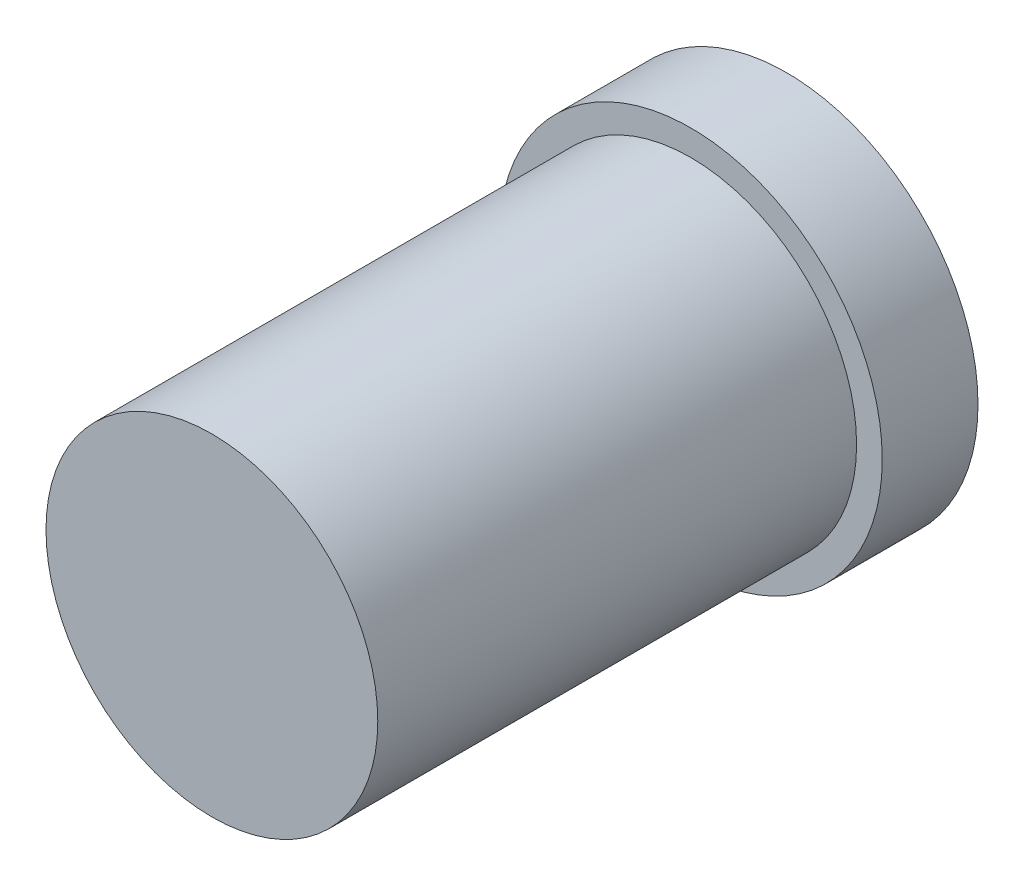
ISO-10303-21;
HEADER;
FILE_DESCRIPTION(('STEP AP214'),'2;1');
FILE_NAME('part.step','',(''),(''),'','','');
FILE_SCHEMA(('AUTOMOTIVE_DESIGN { 1 0 10303 214 1 1 1 1 }'));
ENDSEC;
DATA;
#1=APPLICATION_CONTEXT('core data for automotive mechanical design processes');
#2=APPLICATION_PROTOCOL_DEFINITION('international standard','automotive_design',2000,#1);
#3=PRODUCT_CONTEXT('',#1,'mechanical');
#4=PRODUCT('Part','Part','',(#3));
#5=PRODUCT_RELATED_PRODUCT_CATEGORY('part','',(#4));
#6=PRODUCT_DEFINITION_FORMATION('','',#4);
#7=PRODUCT_DEFINITION_CONTEXT('part definition',#1,'design');
#8=PRODUCT_DEFINITION('design','',#6,#7);
#9=PRODUCT_DEFINITION_SHAPE('','',#8);
#10=(LENGTH_UNIT() NAMED_UNIT(*) SI_UNIT(.MILLI.,.METRE.));
#11=(NAMED_UNIT(*) PLANE_ANGLE_UNIT() SI_UNIT($,.RADIAN.));
#12=(NAMED_UNIT(*) SI_UNIT($,.STERADIAN.) SOLID_ANGLE_UNIT());
#13=UNCERTAINTY_MEASURE_WITH_UNIT(LENGTH_MEASURE(1.E-05),#10,'distance_accuracy_value','');
#14=(GEOMETRIC_REPRESENTATION_CONTEXT(3) GLOBAL_UNCERTAINTY_ASSIGNED_CONTEXT((#13)) GLOBAL_UNIT_ASSIGNED_CONTEXT((#10,
#11,#12)) REPRESENTATION_CONTEXT('',''));
#15=CARTESIAN_POINT('',(0.,0.,0.));
#16=DIRECTION('',(0.,0.,1.));
#17=DIRECTION('',(1.,0.,0.));
#18=AXIS2_PLACEMENT_3D('',#15,#16,#17);
#19=CARTESIAN_POINT('',(0.,0.,-285.75));
#20=DIRECTION('',(0.,0.,1.));
#21=DIRECTION('',(1.,0.,0.));
#22=AXIS2_PLACEMENT_3D('',#19,#20,#21);
#23=CYLINDRICAL_SURFACE('',#22,82.4992);
#24=CARTESIAN_POINT('',(0.,0.,0.));
#25=DIRECTION('',(0.,0.,1.));
#26=DIRECTION('',(1.,0.,0.));
#27=AXIS2_PLACEMENT_3D('',#24,#25,#26);
#28=CIRCLE('',#27,82.4992);
#29=CARTESIAN_POINT('',(82.4992,0.,0.));
#30=VERTEX_POINT('',#29);
#31=EDGE_CURVE('E10',#30,#30,#28,.T.);
#32=ORIENTED_EDGE('',*,*,#31,.F.);
#33=EDGE_LOOP('',(#32));
#34=FACE_BOUND('',#33,.T.);
#35=CARTESIAN_POINT('',(0.,0.,-238.125));
#36=DIRECTION('',(0.,0.,-1.));
#37=DIRECTION('',(-1.,0.,0.));
#38=AXIS2_PLACEMENT_3D('',#35,#36,#37);
#39=CIRCLE('',#38,82.4992);
#40=CARTESIAN_POINT('',(-82.4992,0.,-238.125));
#41=VERTEX_POINT('',#40);
#42=EDGE_CURVE('E40',#41,#41,#39,.F.);
#43=ORIENTED_EDGE('',*,*,#42,.T.);
#44=EDGE_LOOP('',(#43));
#45=FACE_BOUND('',#44,.T.);
#46=ADVANCED_FACE('F37',(#34,#45),#23,.T.);
#47=CARTESIAN_POINT('',(0.,0.,0.));
#48=DIRECTION('',(0.,0.,1.));
#49=DIRECTION('',(1.,0.,0.));
#50=AXIS2_PLACEMENT_3D('',#47,#48,#49);
#51=PLANE('',#50);
#52=ORIENTED_EDGE('',*,*,#31,.T.);
#53=EDGE_LOOP('',(#52));
#54=FACE_BOUND('',#53,.T.);
#55=ADVANCED_FACE('F73',(#54),#51,.T.);
#56=CARTESIAN_POINT('',(0.,0.,-238.125));
#57=DIRECTION('',(0.,0.,-1.));
#58=DIRECTION('',(-1.,0.,0.));
#59=AXIS2_PLACEMENT_3D('',#56,#57,#58);
#60=CYLINDRICAL_SURFACE('',#59,95.25);
#61=CARTESIAN_POINT('',(0.,0.,-238.125));
#62=DIRECTION('',(0.,0.,-1.));
#63=DIRECTION('',(-1.,0.,0.));
#64=AXIS2_PLACEMENT_3D('',#61,#62,#63);
#65=CIRCLE('',#64,95.25);
#66=CARTESIAN_POINT('',(-95.25,0.,-238.125));
#67=VERTEX_POINT('',#66);
#68=EDGE_CURVE('E49',#67,#67,#65,.T.);
#69=ORIENTED_EDGE('',*,*,#68,.T.);
#70=EDGE_LOOP('',(#69));
#71=FACE_BOUND('',#70,.T.);
#72=CARTESIAN_POINT('',(0.,0.,-285.75));
#73=DIRECTION('',(0.,0.,-1.));
#74=DIRECTION('',(-1.,0.,0.));
#75=AXIS2_PLACEMENT_3D('',#72,#73,#74);
#76=CIRCLE('',#75,95.25);
#77=CARTESIAN_POINT('',(-95.25,0.,-285.75));
#78=VERTEX_POINT('',#77);
#79=EDGE_CURVE('E51',#78,#78,#76,.T.);
#80=ORIENTED_EDGE('',*,*,#79,.F.);
#81=EDGE_LOOP('',(#80));
#82=FACE_BOUND('',#81,.T.);
#83=ADVANCED_FACE('F59',(#71,#82),#60,.T.);
#84=CARTESIAN_POINT('',(0.,0.,-238.125));
#85=DIRECTION('',(0.,0.,-1.));
#86=DIRECTION('',(-1.,0.,0.));
#87=AXIS2_PLACEMENT_3D('',#84,#85,#86);
#88=PLANE('',#87);
#89=ORIENTED_EDGE('',*,*,#42,.F.);
#90=EDGE_LOOP('',(#89));
#91=FACE_BOUND('',#90,.T.);
#92=ORIENTED_EDGE('',*,*,#68,.F.);
#93=EDGE_LOOP('',(#92));
#94=FACE_BOUND('',#93,.T.);
#95=ADVANCED_FACE('F62',(#91,#94),#88,.F.);
#96=CARTESIAN_POINT('',(0.,0.,-285.75));
#97=DIRECTION('',(0.,0.,1.));
#98=DIRECTION('',(1.,0.,0.));
#99=AXIS2_PLACEMENT_3D('',#96,#97,#98);
#100=PLANE('',#99);
#101=ORIENTED_EDGE('',*,*,#79,.T.);
#102=EDGE_LOOP('',(#101));
#103=FACE_BOUND('',#102,.T.);
#104=ADVANCED_FACE('F64',(#103),#100,.F.);
#105=CLOSED_SHELL('',(#46,#55,#83,#95,#104));
#106=MANIFOLD_SOLID_BREP('B2',#105);
#107=ADVANCED_BREP_SHAPE_REPRESENTATION('',(#18,#106),#14);
#108=SHAPE_DEFINITION_REPRESENTATION(#9,#107);
ENDSEC;
END-ISO-10303-21;
